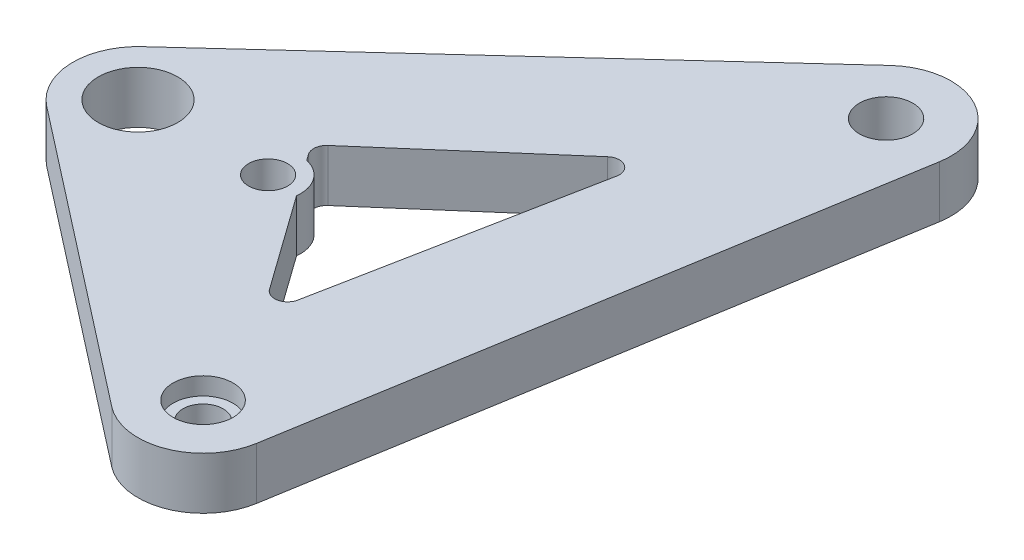
ISO-10303-21;
HEADER;
FILE_DESCRIPTION(('STEP AP214'),'2;1');
FILE_NAME('part.step','',(''),(''),'','','');
FILE_SCHEMA(('AUTOMOTIVE_DESIGN { 1 0 10303 214 1 1 1 1 }'));
ENDSEC;
DATA;
#1=APPLICATION_CONTEXT('core data for automotive mechanical design processes');
#2=APPLICATION_PROTOCOL_DEFINITION('international standard','automotive_design',2000,#1);
#3=PRODUCT_CONTEXT('',#1,'mechanical');
#4=PRODUCT('Part','Part','',(#3));
#5=PRODUCT_RELATED_PRODUCT_CATEGORY('part','',(#4));
#6=PRODUCT_DEFINITION_FORMATION('','',#4);
#7=PRODUCT_DEFINITION_CONTEXT('part definition',#1,'design');
#8=PRODUCT_DEFINITION('design','',#6,#7);
#9=PRODUCT_DEFINITION_SHAPE('','',#8);
#10=(LENGTH_UNIT() NAMED_UNIT(*) SI_UNIT(.MILLI.,.METRE.));
#11=(NAMED_UNIT(*) PLANE_ANGLE_UNIT() SI_UNIT($,.RADIAN.));
#12=(NAMED_UNIT(*) SI_UNIT($,.STERADIAN.) SOLID_ANGLE_UNIT());
#13=UNCERTAINTY_MEASURE_WITH_UNIT(LENGTH_MEASURE(1.E-05),#10,'distance_accuracy_value','');
#14=(GEOMETRIC_REPRESENTATION_CONTEXT(3) GLOBAL_UNCERTAINTY_ASSIGNED_CONTEXT((#13)) GLOBAL_UNIT_ASSIGNED_CONTEXT((#10,
#11,#12)) REPRESENTATION_CONTEXT('',''));
#15=CARTESIAN_POINT('',(0.,0.,0.));
#16=DIRECTION('',(0.,0.,1.));
#17=DIRECTION('',(1.,0.,0.));
#18=AXIS2_PLACEMENT_3D('',#15,#16,#17);
#19=CARTESIAN_POINT('',(110.,-153.7,135.));
#20=DIRECTION('',(0.,1.,0.));
#21=DIRECTION('',(0.,0.,-1.));
#22=AXIS2_PLACEMENT_3D('',#19,#20,#21);
#23=PLANE('',#22);
#24=CARTESIAN_POINT('',(110.,-153.7,135.));
#25=DIRECTION('',(0.,-1.,0.));
#26=DIRECTION('',(1.,0.,0.));
#27=AXIS2_PLACEMENT_3D('',#24,#25,#26);
#28=CIRCLE('',#27,3.1);
#29=CARTESIAN_POINT('',(113.1,-153.7,135.));
#30=VERTEX_POINT('',#29);
#31=EDGE_CURVE('E25',#30,#30,#28,.T.);
#32=ORIENTED_EDGE('',*,*,#31,.T.);
#33=EDGE_LOOP('',(#32));
#34=FACE_BOUND('',#33,.T.);
#35=CARTESIAN_POINT('',(110.,-153.7,135.));
#36=DIRECTION('',(0.,-1.,0.));
#37=DIRECTION('',(1.,0.,0.));
#38=AXIS2_PLACEMENT_3D('',#35,#36,#37);
#39=CIRCLE('',#38,4.6);
#40=CARTESIAN_POINT('',(114.6,-153.7,135.));
#41=VERTEX_POINT('',#40);
#42=EDGE_CURVE('E46',#41,#41,#39,.T.);
#43=ORIENTED_EDGE('',*,*,#42,.F.);
#44=EDGE_LOOP('',(#43));
#45=FACE_BOUND('',#44,.T.);
#46=ADVANCED_FACE('F16',(#34,#45),#23,.T.);
#47=CARTESIAN_POINT('',(110.,-161.,135.));
#48=DIRECTION('',(0.,1.,0.));
#49=DIRECTION('',(1.,0.,0.));
#50=AXIS2_PLACEMENT_3D('',#47,#48,#49);
#51=CYLINDRICAL_SURFACE('',#50,3.1);
#52=ORIENTED_EDGE('',*,*,#31,.F.);
#53=DIRECTION('',(0.,1.,0.));
#54=VECTOR('',#53,1.);
#55=CARTESIAN_POINT('',(113.1,-161.,135.));
#56=LINE('',#55,#54);
#57=CARTESIAN_POINT('',(113.1,-159.,135.));
#58=VERTEX_POINT('',#57);
#59=EDGE_CURVE('E11',#58,#30,#56,.T.);
#60=ORIENTED_EDGE('',*,*,#59,.F.);
#61=CARTESIAN_POINT('',(110.,-159.,135.));
#62=DIRECTION('',(0.,-1.,0.));
#63=DIRECTION('',(1.,0.,0.));
#64=AXIS2_PLACEMENT_3D('',#61,#62,#63);
#65=CIRCLE('',#64,3.1);
#66=EDGE_CURVE('E378',#58,#58,#65,.T.);
#67=ORIENTED_EDGE('',*,*,#66,.T.);
#68=ORIENTED_EDGE('',*,*,#59,.T.);
#69=EDGE_LOOP('',(#52,#60,#67,#68));
#70=FACE_BOUND('',#69,.T.);
#71=ADVANCED_FACE('F449',(#70),#51,.F.);
#72=CARTESIAN_POINT('',(110.,-153.7,135.));
#73=DIRECTION('',(0.,1.,0.));
#74=DIRECTION('',(1.,0.,0.));
#75=AXIS2_PLACEMENT_3D('',#72,#73,#74);
#76=CYLINDRICAL_SURFACE('',#75,4.6);
#77=CARTESIAN_POINT('',(110.,-151.,135.));
#78=DIRECTION('',(0.,-1.,0.));
#79=DIRECTION('',(1.,0.,0.));
#80=AXIS2_PLACEMENT_3D('',#77,#78,#79);
#81=CIRCLE('',#80,4.6);
#82=CARTESIAN_POINT('',(114.6,-151.,135.));
#83=VERTEX_POINT('',#82);
#84=EDGE_CURVE('E308',#83,#83,#81,.T.);
#85=ORIENTED_EDGE('',*,*,#84,.F.);
#86=DIRECTION('',(0.,1.,0.));
#87=VECTOR('',#86,1.);
#88=CARTESIAN_POINT('',(114.6,-153.7,135.));
#89=LINE('',#88,#87);
#90=EDGE_CURVE('E19',#41,#83,#89,.T.);
#91=ORIENTED_EDGE('',*,*,#90,.F.);
#92=ORIENTED_EDGE('',*,*,#42,.T.);
#93=ORIENTED_EDGE('',*,*,#90,.T.);
#94=EDGE_LOOP('',(#85,#91,#92,#93));
#95=FACE_BOUND('',#94,.T.);
#96=ADVANCED_FACE('F404',(#95),#76,.F.);
#97=CARTESIAN_POINT('',(85.,-159.,100.));
#98=DIRECTION('',(0.,1.,0.));
#99=DIRECTION('',(1.,0.,0.));
#100=AXIS2_PLACEMENT_3D('',#97,#98,#99);
#101=CYLINDRICAL_SURFACE('',#100,5.);
#102=DIRECTION('',(0.,1.,0.));
#103=VECTOR('',#102,1.);
#104=CARTESIAN_POINT('',(89.964861374628,-159.,100.59173603129));
#105=LINE('',#104,#103);
#106=CARTESIAN_POINT('',(89.964861374629,-159.,100.59173603128));
#107=VERTEX_POINT('',#106);
#108=CARTESIAN_POINT('',(89.964861374629,-151.,100.59173603128));
#109=VERTEX_POINT('',#108);
#110=EDGE_CURVE('E348',#107,#109,#105,.T.);
#111=ORIENTED_EDGE('',*,*,#110,.F.);
#112=CARTESIAN_POINT('',(85.,-159.,100.));
#113=DIRECTION('',(0.,1.,0.));
#114=DIRECTION('',(0.992972274925726,0.,0.118347206256967));
#115=AXIS2_PLACEMENT_3D('',#112,#113,#114);
#116=CIRCLE('',#115,5.);
#117=CARTESIAN_POINT('',(86.050475010828,-159.,95.111595121962));
#118=VERTEX_POINT('',#117);
#119=EDGE_CURVE('E247',#107,#118,#116,.T.);
#120=ORIENTED_EDGE('',*,*,#119,.T.);
#121=DIRECTION('',(0.,1.,0.));
#122=VECTOR('',#121,1.);
#123=CARTESIAN_POINT('',(86.050475010824,-159.,95.111595121961));
#124=LINE('',#123,#122);
#125=CARTESIAN_POINT('',(86.050475010828,-151.,95.111595121962));
#126=VERTEX_POINT('',#125);
#127=EDGE_CURVE('E396',#118,#126,#124,.T.);
#128=ORIENTED_EDGE('',*,*,#127,.T.);
#129=CARTESIAN_POINT('',(85.,-151.,100.));
#130=DIRECTION('',(0.,-1.,0.));
#131=DIRECTION('',(0.210095002165901,0.,-0.977680975607539));
#132=AXIS2_PLACEMENT_3D('',#129,#130,#131);
#133=CIRCLE('',#132,5.);
#134=EDGE_CURVE('E241',#126,#109,#133,.T.);
#135=ORIENTED_EDGE('',*,*,#134,.T.);
#136=EDGE_LOOP('',(#111,#120,#128,#135));
#137=FACE_BOUND('',#136,.T.);
#138=ADVANCED_FACE('F504',(#137),#101,.T.);
#139=CARTESIAN_POINT('',(100.37253305758,-161.,115.16247638743));
#140=DIRECTION('',(0.81373347120687,0.,-0.581238193718907));
#141=DIRECTION('',(0.,-1.,0.));
#142=AXIS2_PLACEMENT_3D('',#139,#140,#141);
#143=PLANE('',#142);
#144=DIRECTION('',(0.581238193718907,0.,0.81373347120687));
#145=VECTOR('',#144,1.);
#146=CARTESIAN_POINT('',(94.857607265158,-151.,107.44158027803));
#147=LINE('',#146,#145);
#148=CARTESIAN_POINT('',(85.372533057587,-151.,94.162476387438));
#149=VERTEX_POINT('',#148);
#150=EDGE_CURVE('E289',#149,#126,#147,.T.);
#151=ORIENTED_EDGE('',*,*,#150,.T.);
#152=ORIENTED_EDGE('',*,*,#127,.F.);
#153=DIRECTION('',(0.581238193718907,0.,0.81373347120687));
#154=VECTOR('',#153,1.);
#155=CARTESIAN_POINT('',(94.857607265158,-159.,107.44158027803));
#156=LINE('',#155,#154);
#157=CARTESIAN_POINT('',(85.372533057587,-159.,94.162476387438));
#158=VERTEX_POINT('',#157);
#159=EDGE_CURVE('E251',#158,#118,#156,.T.);
#160=ORIENTED_EDGE('',*,*,#159,.F.);
#161=DIRECTION('',(0.,1.,0.));
#162=VECTOR('',#161,1.);
#163=CARTESIAN_POINT('',(85.372533057587,-161.,94.162476387438));
#164=LINE('',#163,#162);
#165=EDGE_CURVE('E332',#158,#149,#164,.T.);
#166=ORIENTED_EDGE('',*,*,#165,.T.);
#167=EDGE_LOOP('',(#151,#152,#160,#166));
#168=FACE_BOUND('',#167,.T.);
#169=ADVANCED_FACE('F500',(#168),#143,.T.);
#170=CARTESIAN_POINT('',(100.37253305758,-161.,115.16247638743));
#171=DIRECTION('',(0.81373347120687,0.,-0.581238193718907));
#172=DIRECTION('',(0.,-1.,0.));
#173=AXIS2_PLACEMENT_3D('',#170,#171,#172);
#174=PLANE('',#173);
#175=DIRECTION('',(0.581238193718907,0.,0.81373347120687));
#176=VECTOR('',#175,1.);
#177=CARTESIAN_POINT('',(94.857607265158,-151.,107.44158027803));
#178=LINE('',#177,#176);
#179=CARTESIAN_POINT('',(100.37253305758,-151.,115.16247638743));
#180=VERTEX_POINT('',#179);
#181=EDGE_CURVE('E237',#109,#180,#178,.T.);
#182=ORIENTED_EDGE('',*,*,#181,.T.);
#183=DIRECTION('',(0.,1.,0.));
#184=VECTOR('',#183,1.);
#185=CARTESIAN_POINT('',(100.37253305758,-161.,115.16247638743));
#186=LINE('',#185,#184);
#187=CARTESIAN_POINT('',(100.37253305758,-159.,115.16247638743));
#188=VERTEX_POINT('',#187);
#189=EDGE_CURVE('E329',#188,#180,#186,.T.);
#190=ORIENTED_EDGE('',*,*,#189,.F.);
#191=DIRECTION('',(0.581238193718907,0.,0.81373347120687));
#192=VECTOR('',#191,1.);
#193=CARTESIAN_POINT('',(94.857607265158,-159.,107.44158027803));
#194=LINE('',#193,#192);
#195=EDGE_CURVE('E250',#107,#188,#194,.T.);
#196=ORIENTED_EDGE('',*,*,#195,.F.);
#197=ORIENTED_EDGE('',*,*,#110,.T.);
#198=EDGE_LOOP('',(#182,#190,#196,#197));
#199=FACE_BOUND('',#198,.T.);
#200=ADVANCED_FACE('F496',(#199),#174,.T.);
#201=CARTESIAN_POINT('',(87.,-161.,93.));
#202=DIRECTION('',(0.,-1.,0.));
#203=DIRECTION('',(0.754605522163612,0.,-0.656178714924663));
#204=AXIS2_PLACEMENT_3D('',#201,#202,#203);
#205=CYLINDRICAL_SURFACE('',#204,2.);
#206=CARTESIAN_POINT('',(87.,-159.,93.));
#207=DIRECTION('',(0.,1.,0.));
#208=DIRECTION('',(0.754605522163612,0.,-0.656178714924663));
#209=AXIS2_PLACEMENT_3D('',#206,#207,#208);
#210=CIRCLE('',#209,2.);
#211=CARTESIAN_POINT('',(85.68764257015,-159.,91.490788955673));
#212=VERTEX_POINT('',#211);
#213=EDGE_CURVE('E360',#212,#158,#210,.T.);
#214=ORIENTED_EDGE('',*,*,#213,.F.);
#215=DIRECTION('',(0.,1.,0.));
#216=VECTOR('',#215,1.);
#217=CARTESIAN_POINT('',(85.68764257015,-161.,91.490788955673));
#218=LINE('',#217,#216);
#219=CARTESIAN_POINT('',(85.68764257015,-151.,91.490788955673));
#220=VERTEX_POINT('',#219);
#221=EDGE_CURVE('E333',#212,#220,#218,.T.);
#222=ORIENTED_EDGE('',*,*,#221,.T.);
#223=CARTESIAN_POINT('',(87.,-151.,93.));
#224=DIRECTION('',(0.,1.,0.));
#225=DIRECTION('',(0.754605522163612,0.,-0.656178714924663));
#226=AXIS2_PLACEMENT_3D('',#223,#224,#225);
#227=CIRCLE('',#226,2.);
#228=EDGE_CURVE('E293',#220,#149,#227,.T.);
#229=ORIENTED_EDGE('',*,*,#228,.T.);
#230=ORIENTED_EDGE('',*,*,#165,.F.);
#231=EDGE_LOOP('',(#214,#222,#229,#230));
#232=FACE_BOUND('',#231,.T.);
#233=ADVANCED_FACE('F492',(#232),#205,.F.);
#234=CARTESIAN_POINT('',(102.,-161.,114.));
#235=DIRECTION('',(0.,-1.,0.));
#236=DIRECTION('',(-0.581238193718907,0.,-0.81373347120687));
#237=AXIS2_PLACEMENT_3D('',#234,#235,#236);
#238=CYLINDRICAL_SURFACE('',#237,2.);
#239=CARTESIAN_POINT('',(102.,-159.,114.));
#240=DIRECTION('',(0.,1.,0.));
#241=DIRECTION('',(-0.581238193718907,0.,-0.81373347120687));
#242=AXIS2_PLACEMENT_3D('',#239,#240,#241);
#243=CIRCLE('',#242,2.);
#244=CARTESIAN_POINT('',(103.96298118405,-159.,114.38302071883));
#245=VERTEX_POINT('',#244);
#246=EDGE_CURVE('E370',#188,#245,#243,.T.);
#247=ORIENTED_EDGE('',*,*,#246,.F.);
#248=ORIENTED_EDGE('',*,*,#189,.T.);
#249=CARTESIAN_POINT('',(102.,-151.,114.));
#250=DIRECTION('',(0.,1.,0.));
#251=DIRECTION('',(-0.581238193718907,0.,-0.81373347120687));
#252=AXIS2_PLACEMENT_3D('',#249,#250,#251);
#253=CIRCLE('',#252,2.);
#254=CARTESIAN_POINT('',(103.96298118405,-151.,114.38302071883));
#255=VERTEX_POINT('',#254);
#256=EDGE_CURVE('E242',#180,#255,#253,.T.);
#257=ORIENTED_EDGE('',*,*,#256,.T.);
#258=DIRECTION('',(0.,1.,0.));
#259=VECTOR('',#258,1.);
#260=CARTESIAN_POINT('',(103.96298118405,-161.,114.38302071883));
#261=LINE('',#260,#259);
#262=EDGE_CURVE('E266',#245,#255,#261,.T.);
#263=ORIENTED_EDGE('',*,*,#262,.F.);
#264=EDGE_LOOP('',(#247,#248,#257,#263));
#265=FACE_BOUND('',#264,.T.);
#266=ADVANCED_FACE('F495',(#265),#238,.F.);
#267=CARTESIAN_POINT('',(85.68764257015,-161.,91.490788955673));
#268=DIRECTION('',(0.656178714924663,0.,0.754605522163612));
#269=DIRECTION('',(0.,-1.,0.));
#270=AXIS2_PLACEMENT_3D('',#267,#268,#269);
#271=PLANE('',#270);
#272=DIRECTION('',(0.,1.,0.));
#273=VECTOR('',#272,1.);
#274=CARTESIAN_POINT('',(108.68764257015,-161.,71.490788955673));
#275=LINE('',#274,#273);
#276=CARTESIAN_POINT('',(108.68764257015,-159.,71.490788955673));
#277=VERTEX_POINT('',#276);
#278=CARTESIAN_POINT('',(108.68764257015,-151.,71.490788955673));
#279=VERTEX_POINT('',#278);
#280=EDGE_CURVE('E263',#277,#279,#275,.T.);
#281=ORIENTED_EDGE('',*,*,#280,.T.);
#282=DIRECTION('',(-0.754605522163612,0.,0.656178714924663));
#283=VECTOR('',#282,1.);
#284=CARTESIAN_POINT('',(90.568697703843,-151.,87.246393187245));
#285=LINE('',#284,#283);
#286=EDGE_CURVE('E297',#279,#220,#285,.T.);
#287=ORIENTED_EDGE('',*,*,#286,.T.);
#288=ORIENTED_EDGE('',*,*,#221,.F.);
#289=DIRECTION('',(-0.754605522163612,0.,0.656178714924663));
#290=VECTOR('',#289,1.);
#291=CARTESIAN_POINT('',(90.568697703843,-159.,87.246393187245));
#292=LINE('',#291,#290);
#293=EDGE_CURVE('E356',#277,#212,#292,.T.);
#294=ORIENTED_EDGE('',*,*,#293,.F.);
#295=EDGE_LOOP('',(#281,#287,#288,#294));
#296=FACE_BOUND('',#295,.T.);
#297=ADVANCED_FACE('F479',(#296),#271,.T.);
#298=CARTESIAN_POINT('',(111.96298118405,-161.,73.383020718839));
#299=DIRECTION('',(-0.981490592025644,0.,-0.19151035941993));
#300=DIRECTION('',(-0.19151035941993,0.,0.981490592025644));
#301=AXIS2_PLACEMENT_3D('',#298,#299,#300);
#302=PLANE('',#301);
#303=ORIENTED_EDGE('',*,*,#262,.T.);
#304=DIRECTION('',(0.19151035941993,0.,-0.981490592025644));
#305=VECTOR('',#304,1.);
#306=CARTESIAN_POINT('',(110.16133024366,-151.,82.616481788341));
#307=LINE('',#306,#305);
#308=CARTESIAN_POINT('',(111.96298118405,-151.,73.383020718839));
#309=VERTEX_POINT('',#308);
#310=EDGE_CURVE('E234',#255,#309,#307,.T.);
#311=ORIENTED_EDGE('',*,*,#310,.T.);
#312=DIRECTION('',(0.,1.,0.));
#313=VECTOR('',#312,1.);
#314=CARTESIAN_POINT('',(111.96298118405,-161.,73.383020718839));
#315=LINE('',#314,#313);
#316=CARTESIAN_POINT('',(111.96298118405,-159.,73.383020718839));
#317=VERTEX_POINT('',#316);
#318=EDGE_CURVE('E267',#317,#309,#315,.T.);
#319=ORIENTED_EDGE('',*,*,#318,.F.);
#320=DIRECTION('',(0.19151035941993,0.,-0.981490592025644));
#321=VECTOR('',#320,1.);
#322=CARTESIAN_POINT('',(110.16133024366,-159.,82.616481788341));
#323=LINE('',#322,#321);
#324=EDGE_CURVE('E374',#245,#317,#323,.T.);
#325=ORIENTED_EDGE('',*,*,#324,.F.);
#326=EDGE_LOOP('',(#303,#311,#319,#325));
#327=FACE_BOUND('',#326,.T.);
#328=ADVANCED_FACE('F485',(#327),#302,.T.);
#329=CARTESIAN_POINT('',(110.,-161.,73.));
#330=DIRECTION('',(0.,-1.,0.));
#331=DIRECTION('',(-0.19151035941993,0.,0.981490592025644));
#332=AXIS2_PLACEMENT_3D('',#329,#330,#331);
#333=CYLINDRICAL_SURFACE('',#332,2.);
#334=CARTESIAN_POINT('',(110.,-159.,73.));
#335=DIRECTION('',(0.,1.,0.));
#336=DIRECTION('',(-0.19151035941993,0.,0.981490592025644));
#337=AXIS2_PLACEMENT_3D('',#334,#335,#336);
#338=CIRCLE('',#337,2.);
#339=EDGE_CURVE('E345',#317,#277,#338,.T.);
#340=ORIENTED_EDGE('',*,*,#339,.F.);
#341=ORIENTED_EDGE('',*,*,#318,.T.);
#342=CARTESIAN_POINT('',(110.,-151.,73.));
#343=DIRECTION('',(0.,1.,0.));
#344=DIRECTION('',(-0.19151035941993,0.,0.981490592025644));
#345=AXIS2_PLACEMENT_3D('',#342,#343,#344);
#346=CIRCLE('',#345,2.);
#347=EDGE_CURVE('E301',#309,#279,#346,.T.);
#348=ORIENTED_EDGE('',*,*,#347,.T.);
#349=ORIENTED_EDGE('',*,*,#280,.F.);
#350=EDGE_LOOP('',(#340,#341,#348,#349));
#351=FACE_BOUND('',#350,.T.);
#352=ADVANCED_FACE('F483',(#351),#333,.F.);
#353=CARTESIAN_POINT('',(85.,-161.,100.));
#354=DIRECTION('',(0.,1.,0.));
#355=DIRECTION('',(1.,0.,0.));
#356=AXIS2_PLACEMENT_3D('',#353,#354,#355);
#357=CYLINDRICAL_SURFACE('',#356,3.);
#358=CARTESIAN_POINT('',(85.,-151.,100.));
#359=DIRECTION('',(0.,-1.,0.));
#360=DIRECTION('',(1.,0.,0.));
#361=AXIS2_PLACEMENT_3D('',#358,#359,#360);
#362=CIRCLE('',#361,3.);
#363=CARTESIAN_POINT('',(88.,-151.,100.));
#364=VERTEX_POINT('',#363);
#365=EDGE_CURVE('E232',#364,#364,#362,.T.);
#366=ORIENTED_EDGE('',*,*,#365,.F.);
#367=DIRECTION('',(0.,1.,0.));
#368=VECTOR('',#367,1.);
#369=CARTESIAN_POINT('',(88.,-161.,100.));
#370=LINE('',#369,#368);
#371=CARTESIAN_POINT('',(88.,-159.,100.));
#372=VERTEX_POINT('',#371);
#373=EDGE_CURVE('E304',#372,#364,#370,.T.);
#374=ORIENTED_EDGE('',*,*,#373,.F.);
#375=CARTESIAN_POINT('',(85.,-159.,100.));
#376=DIRECTION('',(0.,-1.,0.));
#377=DIRECTION('',(1.,0.,0.));
#378=AXIS2_PLACEMENT_3D('',#375,#376,#377);
#379=CIRCLE('',#378,3.);
#380=EDGE_CURVE('E341',#372,#372,#379,.T.);
#381=ORIENTED_EDGE('',*,*,#380,.T.);
#382=ORIENTED_EDGE('',*,*,#373,.T.);
#383=EDGE_LOOP('',(#366,#374,#381,#382));
#384=FACE_BOUND('',#383,.T.);
#385=ADVANCED_FACE('F475',(#384),#357,.F.);
#386=CARTESIAN_POINT('',(65.,-161.,100.));
#387=DIRECTION('',(0.,1.,0.));
#388=DIRECTION('',(1.,0.,0.));
#389=AXIS2_PLACEMENT_3D('',#386,#387,#388);
#390=CYLINDRICAL_SURFACE('',#389,6.1);
#391=CARTESIAN_POINT('',(65.,-151.,100.));
#392=DIRECTION('',(0.,-1.,0.));
#393=DIRECTION('',(1.,0.,0.));
#394=AXIS2_PLACEMENT_3D('',#391,#392,#393);
#395=CIRCLE('',#394,6.1);
#396=CARTESIAN_POINT('',(71.1,-151.,100.));
#397=VERTEX_POINT('',#396);
#398=EDGE_CURVE('E235',#397,#397,#395,.T.);
#399=ORIENTED_EDGE('',*,*,#398,.F.);
#400=DIRECTION('',(0.,1.,0.));
#401=VECTOR('',#400,1.);
#402=CARTESIAN_POINT('',(71.1,-161.,100.));
#403=LINE('',#402,#401);
#404=CARTESIAN_POINT('',(71.1,-159.,100.));
#405=VERTEX_POINT('',#404);
#406=EDGE_CURVE('E349',#405,#397,#403,.T.);
#407=ORIENTED_EDGE('',*,*,#406,.F.);
#408=CARTESIAN_POINT('',(65.,-159.,100.));
#409=DIRECTION('',(0.,-1.,0.));
#410=DIRECTION('',(1.,0.,0.));
#411=AXIS2_PLACEMENT_3D('',#408,#409,#410);
#412=CIRCLE('',#411,6.1);
#413=EDGE_CURVE('E337',#405,#405,#412,.T.);
#414=ORIENTED_EDGE('',*,*,#413,.T.);
#415=ORIENTED_EDGE('',*,*,#406,.T.);
#416=EDGE_LOOP('',(#399,#407,#414,#415));
#417=FACE_BOUND('',#416,.T.);
#418=ADVANCED_FACE('F468',(#417),#390,.F.);
#419=CARTESIAN_POINT('',(125.,-161.,45.));
#420=DIRECTION('',(0.,1.,0.));
#421=DIRECTION('',(1.,0.,0.));
#422=AXIS2_PLACEMENT_3D('',#419,#420,#421);
#423=CYLINDRICAL_SURFACE('',#422,4.1);
#424=CARTESIAN_POINT('',(125.,-151.,45.));
#425=DIRECTION('',(0.,-1.,0.));
#426=DIRECTION('',(1.,0.,0.));
#427=AXIS2_PLACEMENT_3D('',#424,#425,#426);
#428=CIRCLE('',#427,4.1);
#429=CARTESIAN_POINT('',(129.1,-151.,45.));
#430=VERTEX_POINT('',#429);
#431=EDGE_CURVE('E260',#430,#430,#428,.T.);
#432=ORIENTED_EDGE('',*,*,#431,.F.);
#433=DIRECTION('',(0.,1.,0.));
#434=VECTOR('',#433,1.);
#435=CARTESIAN_POINT('',(129.1,-161.,45.));
#436=LINE('',#435,#434);
#437=CARTESIAN_POINT('',(129.1,-159.,45.));
#438=VERTEX_POINT('',#437);
#439=EDGE_CURVE('E352',#438,#430,#436,.T.);
#440=ORIENTED_EDGE('',*,*,#439,.F.);
#441=CARTESIAN_POINT('',(125.,-159.,45.));
#442=DIRECTION('',(0.,-1.,0.));
#443=DIRECTION('',(1.,0.,0.));
#444=AXIS2_PLACEMENT_3D('',#441,#442,#443);
#445=CIRCLE('',#444,4.1);
#446=EDGE_CURVE('E328',#438,#438,#445,.T.);
#447=ORIENTED_EDGE('',*,*,#446,.T.);
#448=ORIENTED_EDGE('',*,*,#439,.T.);
#449=EDGE_LOOP('',(#432,#440,#447,#448));
#450=FACE_BOUND('',#449,.T.);
#451=ADVANCED_FACE('F466',(#450),#423,.F.);
#452=CARTESIAN_POINT('',(134.86393923832,-159.,46.643989873054));
#453=DIRECTION('',(-0.986393923832198,0.,-0.164398987305033));
#454=DIRECTION('',(-0.164398987305033,0.,0.986393923832198));
#455=AXIS2_PLACEMENT_3D('',#452,#453,#454);
#456=PLANE('',#455);
#457=DIRECTION('',(0.,1.,0.));
#458=VECTOR('',#457,1.);
#459=CARTESIAN_POINT('',(134.86393923832,-159.,46.643989873054));
#460=LINE('',#459,#458);
#461=CARTESIAN_POINT('',(134.86393923832,-159.,46.643989873054));
#462=VERTEX_POINT('',#461);
#463=CARTESIAN_POINT('',(134.86393923832,-151.,46.643989873054));
#464=VERTEX_POINT('',#463);
#465=EDGE_CURVE('E381',#462,#464,#460,.T.);
#466=ORIENTED_EDGE('',*,*,#465,.T.);
#467=DIRECTION('',(-0.164398987305033,0.,0.986393923832198));
#468=VECTOR('',#467,1.);
#469=CARTESIAN_POINT('',(134.86393923832,-151.,46.643989873054));
#470=LINE('',#469,#468);
#471=CARTESIAN_POINT('',(119.86393923832,-151.,136.64398987305));
#472=VERTEX_POINT('',#471);
#473=EDGE_CURVE('E231',#464,#472,#470,.T.);
#474=ORIENTED_EDGE('',*,*,#473,.T.);
#475=DIRECTION('',(0.,1.,0.));
#476=VECTOR('',#475,1.);
#477=CARTESIAN_POINT('',(119.86393923832,-159.,136.64398987305));
#478=LINE('',#477,#476);
#479=CARTESIAN_POINT('',(119.86393923832,-159.,136.64398987305));
#480=VERTEX_POINT('',#479);
#481=EDGE_CURVE('E384',#480,#472,#478,.T.);
#482=ORIENTED_EDGE('',*,*,#481,.F.);
#483=DIRECTION('',(-0.164398987305033,0.,0.986393923832198));
#484=VECTOR('',#483,1.);
#485=CARTESIAN_POINT('',(134.86393923832,-159.,46.643989873054));
#486=LINE('',#485,#484);
#487=EDGE_CURVE('E320',#462,#480,#486,.T.);
#488=ORIENTED_EDGE('',*,*,#487,.F.);
#489=EDGE_LOOP('',(#466,#474,#482,#488));
#490=FACE_BOUND('',#489,.T.);
#491=ADVANCED_FACE('F431',(#490),#456,.F.);
#492=CARTESIAN_POINT('',(110.,-159.,135.));
#493=DIRECTION('',(0.,-1.,0.));
#494=DIRECTION('',(-0.789352217376165,0.,-0.613940613515128));
#495=AXIS2_PLACEMENT_3D('',#492,#493,#494);
#496=CYLINDRICAL_SURFACE('',#495,10.);
#497=CARTESIAN_POINT('',(110.,-159.,135.));
#498=DIRECTION('',(0.,1.,0.));
#499=DIRECTION('',(-0.789352217376165,0.,-0.613940613515128));
#500=AXIS2_PLACEMENT_3D('',#497,#498,#499);
#501=CIRCLE('',#500,10.);
#502=CARTESIAN_POINT('',(103.86059386485,-159.,142.89352217376));
#503=VERTEX_POINT('',#502);
#504=EDGE_CURVE('E324',#503,#480,#501,.T.);
#505=ORIENTED_EDGE('',*,*,#504,.T.);
#506=ORIENTED_EDGE('',*,*,#481,.T.);
#507=CARTESIAN_POINT('',(110.,-151.,135.));
#508=DIRECTION('',(0.,1.,0.));
#509=DIRECTION('',(-0.789352217376165,0.,-0.613940613515128));
#510=AXIS2_PLACEMENT_3D('',#507,#508,#509);
#511=CIRCLE('',#510,10.);
#512=CARTESIAN_POINT('',(103.86059386485,-151.,142.89352217376));
#513=VERTEX_POINT('',#512);
#514=EDGE_CURVE('E253',#513,#472,#511,.T.);
#515=ORIENTED_EDGE('',*,*,#514,.F.);
#516=DIRECTION('',(0.,1.,0.));
#517=VECTOR('',#516,1.);
#518=CARTESIAN_POINT('',(103.86059386485,-159.,142.89352217376));
#519=LINE('',#518,#517);
#520=EDGE_CURVE('E312',#503,#513,#519,.T.);
#521=ORIENTED_EDGE('',*,*,#520,.F.);
#522=EDGE_LOOP('',(#505,#506,#515,#521));
#523=FACE_BOUND('',#522,.T.);
#524=ADVANCED_FACE('F427',(#523),#496,.T.);
#525=CARTESIAN_POINT('',(125.,-159.,45.));
#526=DIRECTION('',(0.,-1.,0.));
#527=DIRECTION('',(-0.164398987305033,0.,0.986393923832198));
#528=AXIS2_PLACEMENT_3D('',#525,#526,#527);
#529=CYLINDRICAL_SURFACE('',#528,10.);
#530=CARTESIAN_POINT('',(125.,-159.,45.));
#531=DIRECTION('',(0.,1.,0.));
#532=DIRECTION('',(-0.164398987305033,0.,0.986393923832198));
#533=AXIS2_PLACEMENT_3D('',#530,#531,#532);
#534=CIRCLE('',#533,10.);
#535=CARTESIAN_POINT('',(118.24275371482,-159.,37.628458597993));
#536=VERTEX_POINT('',#535);
#537=EDGE_CURVE('E317',#462,#536,#534,.T.);
#538=ORIENTED_EDGE('',*,*,#537,.T.);
#539=DIRECTION('',(0.,1.,0.));
#540=VECTOR('',#539,1.);
#541=CARTESIAN_POINT('',(118.24275371482,-159.,37.628458597993));
#542=LINE('',#541,#540);
#543=CARTESIAN_POINT('',(118.24275371482,-151.,37.628458597993));
#544=VERTEX_POINT('',#543);
#545=EDGE_CURVE('E200',#536,#544,#542,.T.);
#546=ORIENTED_EDGE('',*,*,#545,.T.);
#547=CARTESIAN_POINT('',(125.,-151.,45.));
#548=DIRECTION('',(0.,1.,0.));
#549=DIRECTION('',(-0.164398987305033,0.,0.986393923832198));
#550=AXIS2_PLACEMENT_3D('',#547,#548,#549);
#551=CIRCLE('',#550,10.);
#552=EDGE_CURVE('E274',#464,#544,#551,.T.);
#553=ORIENTED_EDGE('',*,*,#552,.F.);
#554=ORIENTED_EDGE('',*,*,#465,.F.);
#555=EDGE_LOOP('',(#538,#546,#553,#554));
#556=FACE_BOUND('',#555,.T.);
#557=ADVANCED_FACE('F437',(#556),#529,.T.);
#558=CARTESIAN_POINT('',(102.07775670149,-159.,90.624201862374));
#559=DIRECTION('',(0.,1.,0.));
#560=DIRECTION('',(0.,0.,-1.));
#561=AXIS2_PLACEMENT_3D('',#558,#559,#560);
#562=PLANE('',#561);
#563=ORIENTED_EDGE('',*,*,#66,.F.);
#564=EDGE_LOOP('',(#563));
#565=FACE_BOUND('',#564,.T.);
#566=ORIENTED_EDGE('',*,*,#339,.T.);
#567=ORIENTED_EDGE('',*,*,#293,.T.);
#568=ORIENTED_EDGE('',*,*,#213,.T.);
#569=ORIENTED_EDGE('',*,*,#159,.T.);
#570=ORIENTED_EDGE('',*,*,#119,.F.);
#571=ORIENTED_EDGE('',*,*,#195,.T.);
#572=ORIENTED_EDGE('',*,*,#246,.T.);
#573=ORIENTED_EDGE('',*,*,#324,.T.);
#574=EDGE_LOOP('',(#566,#567,#568,#569,#570,#571,#572,#573));
#575=FACE_BOUND('',#574,.T.);
#576=ORIENTED_EDGE('',*,*,#380,.F.);
#577=EDGE_LOOP('',(#576));
#578=FACE_BOUND('',#577,.T.);
#579=ORIENTED_EDGE('',*,*,#413,.F.);
#580=EDGE_LOOP('',(#579));
#581=FACE_BOUND('',#580,.T.);
#582=ORIENTED_EDGE('',*,*,#446,.F.);
#583=EDGE_LOOP('',(#582));
#584=FACE_BOUND('',#583,.T.);
#585=CARTESIAN_POINT('',(65.,-159.,100.));
#586=DIRECTION('',(0.,1.,0.));
#587=DIRECTION('',(0.737154140201032,0.,-0.675724628517029));
#588=AXIS2_PLACEMENT_3D('',#585,#586,#587);
#589=CIRCLE('',#588,10.);
#590=CARTESIAN_POINT('',(58.242753714827,-159.,92.628458597993));
#591=VERTEX_POINT('',#590);
#592=CARTESIAN_POINT('',(58.860593864851,-159.,107.89352217376));
#593=VERTEX_POINT('',#592);
#594=EDGE_CURVE('E211',#591,#593,#589,.T.);
#595=ORIENTED_EDGE('',*,*,#594,.F.);
#596=DIRECTION('',(0.737154140201032,0.,-0.675724628517029));
#597=VECTOR('',#596,1.);
#598=CARTESIAN_POINT('',(58.242753714827,-159.,92.628458597993));
#599=LINE('',#598,#597);
#600=EDGE_CURVE('E193',#591,#536,#599,.T.);
#601=ORIENTED_EDGE('',*,*,#600,.T.);
#602=ORIENTED_EDGE('',*,*,#537,.F.);
#603=ORIENTED_EDGE('',*,*,#487,.T.);
#604=ORIENTED_EDGE('',*,*,#504,.F.);
#605=DIRECTION('',(-0.789352217376165,0.,-0.613940613515128));
#606=VECTOR('',#605,1.);
#607=CARTESIAN_POINT('',(103.86059386485,-159.,142.89352217376));
#608=LINE('',#607,#606);
#609=EDGE_CURVE('E219',#503,#593,#608,.T.);
#610=ORIENTED_EDGE('',*,*,#609,.T.);
#611=EDGE_LOOP('',(#595,#601,#602,#603,#604,#610));
#612=FACE_BOUND('',#611,.T.);
#613=ADVANCED_FACE('F217',(#565,#575,#578,#581,#584,#612),#562,.F.);
#614=CARTESIAN_POINT('',(103.86059386485,-159.,142.89352217376));
#615=DIRECTION('',(0.613940613515128,0.,-0.789352217376165));
#616=DIRECTION('',(0.,-1.,0.));
#617=AXIS2_PLACEMENT_3D('',#614,#615,#616);
#618=PLANE('',#617);
#619=ORIENTED_EDGE('',*,*,#520,.T.);
#620=DIRECTION('',(-0.789352217376165,0.,-0.613940613515128));
#621=VECTOR('',#620,1.);
#622=CARTESIAN_POINT('',(103.86059386485,-151.,142.89352217376));
#623=LINE('',#622,#621);
#624=CARTESIAN_POINT('',(58.860593864851,-151.,107.89352217376));
#625=VERTEX_POINT('',#624);
#626=EDGE_CURVE('E205',#513,#625,#623,.T.);
#627=ORIENTED_EDGE('',*,*,#626,.T.);
#628=DIRECTION('',(0.,1.,0.));
#629=VECTOR('',#628,1.);
#630=CARTESIAN_POINT('',(58.860593864851,-159.,107.89352217376));
#631=LINE('',#630,#629);
#632=EDGE_CURVE('E222',#593,#625,#631,.T.);
#633=ORIENTED_EDGE('',*,*,#632,.F.);
#634=ORIENTED_EDGE('',*,*,#609,.F.);
#635=EDGE_LOOP('',(#619,#627,#633,#634));
#636=FACE_BOUND('',#635,.T.);
#637=ADVANCED_FACE('F409',(#636),#618,.F.);
#638=CARTESIAN_POINT('',(102.07775670149,-151.,90.624201862374));
#639=DIRECTION('',(0.,1.,0.));
#640=DIRECTION('',(0.,0.,-1.));
#641=AXIS2_PLACEMENT_3D('',#638,#639,#640);
#642=PLANE('',#641);
#643=ORIENTED_EDGE('',*,*,#84,.T.);
#644=EDGE_LOOP('',(#643));
#645=FACE_BOUND('',#644,.T.);
#646=ORIENTED_EDGE('',*,*,#310,.F.);
#647=ORIENTED_EDGE('',*,*,#256,.F.);
#648=ORIENTED_EDGE('',*,*,#181,.F.);
#649=ORIENTED_EDGE('',*,*,#134,.F.);
#650=ORIENTED_EDGE('',*,*,#150,.F.);
#651=ORIENTED_EDGE('',*,*,#228,.F.);
#652=ORIENTED_EDGE('',*,*,#286,.F.);
#653=ORIENTED_EDGE('',*,*,#347,.F.);
#654=EDGE_LOOP('',(#646,#647,#648,#649,#650,#651,#652,#653));
#655=FACE_BOUND('',#654,.T.);
#656=ORIENTED_EDGE('',*,*,#365,.T.);
#657=EDGE_LOOP('',(#656));
#658=FACE_BOUND('',#657,.T.);
#659=ORIENTED_EDGE('',*,*,#398,.T.);
#660=EDGE_LOOP('',(#659));
#661=FACE_BOUND('',#660,.T.);
#662=ORIENTED_EDGE('',*,*,#431,.T.);
#663=EDGE_LOOP('',(#662));
#664=FACE_BOUND('',#663,.T.);
#665=ORIENTED_EDGE('',*,*,#626,.F.);
#666=ORIENTED_EDGE('',*,*,#514,.T.);
#667=ORIENTED_EDGE('',*,*,#473,.F.);
#668=ORIENTED_EDGE('',*,*,#552,.T.);
#669=DIRECTION('',(0.737154140201032,0.,-0.675724628517029));
#670=VECTOR('',#669,1.);
#671=CARTESIAN_POINT('',(58.242753714827,-151.,92.628458597993));
#672=LINE('',#671,#670);
#673=CARTESIAN_POINT('',(58.242753714827,-151.,92.628458597993));
#674=VERTEX_POINT('',#673);
#675=EDGE_CURVE('E215',#674,#544,#672,.T.);
#676=ORIENTED_EDGE('',*,*,#675,.F.);
#677=CARTESIAN_POINT('',(65.,-151.,100.));
#678=DIRECTION('',(0.,1.,0.));
#679=DIRECTION('',(0.737154140201032,0.,-0.675724628517029));
#680=AXIS2_PLACEMENT_3D('',#677,#678,#679);
#681=CIRCLE('',#680,10.);
#682=EDGE_CURVE('E213',#674,#625,#681,.T.);
#683=ORIENTED_EDGE('',*,*,#682,.T.);
#684=EDGE_LOOP('',(#665,#666,#667,#668,#676,#683));
#685=FACE_BOUND('',#684,.T.);
#686=ADVANCED_FACE('F406',(#645,#655,#658,#661,#664,#685),#642,.T.);
#687=CARTESIAN_POINT('',(58.242753714827,-159.,92.628458597993));
#688=DIRECTION('',(0.675724628517029,0.,0.737154140201032));
#689=DIRECTION('',(0.,-1.,0.));
#690=AXIS2_PLACEMENT_3D('',#687,#688,#689);
#691=PLANE('',#690);
#692=DIRECTION('',(0.,1.,0.));
#693=VECTOR('',#692,1.);
#694=CARTESIAN_POINT('',(58.242753714827,-159.,92.628458597993));
#695=LINE('',#694,#693);
#696=EDGE_CURVE('E197',#591,#674,#695,.T.);
#697=ORIENTED_EDGE('',*,*,#696,.T.);
#698=ORIENTED_EDGE('',*,*,#675,.T.);
#699=ORIENTED_EDGE('',*,*,#545,.F.);
#700=ORIENTED_EDGE('',*,*,#600,.F.);
#701=EDGE_LOOP('',(#697,#698,#699,#700));
#702=FACE_BOUND('',#701,.T.);
#703=ADVANCED_FACE('F195',(#702),#691,.F.);
#704=CARTESIAN_POINT('',(65.,-159.,100.));
#705=DIRECTION('',(0.,-1.,0.));
#706=DIRECTION('',(0.737154140201032,0.,-0.675724628517029));
#707=AXIS2_PLACEMENT_3D('',#704,#705,#706);
#708=CYLINDRICAL_SURFACE('',#707,10.);
#709=ORIENTED_EDGE('',*,*,#594,.T.);
#710=ORIENTED_EDGE('',*,*,#632,.T.);
#711=ORIENTED_EDGE('',*,*,#682,.F.);
#712=ORIENTED_EDGE('',*,*,#696,.F.);
#713=EDGE_LOOP('',(#709,#710,#711,#712));
#714=FACE_BOUND('',#713,.T.);
#715=ADVANCED_FACE('F209',(#714),#708,.T.);
#716=CLOSED_SHELL('',(#46,#71,#96,#138,#169,#200,#233,#266,#297,#328,#352,#385,#418,#451,#491,
#524,#557,#613,#637,#686,#703,#715));
#717=MANIFOLD_SOLID_BREP('B1',#716);
#718=ADVANCED_BREP_SHAPE_REPRESENTATION('',(#18,#717),#14);
#719=SHAPE_DEFINITION_REPRESENTATION(#9,#718);
ENDSEC;
END-ISO-10303-21;
